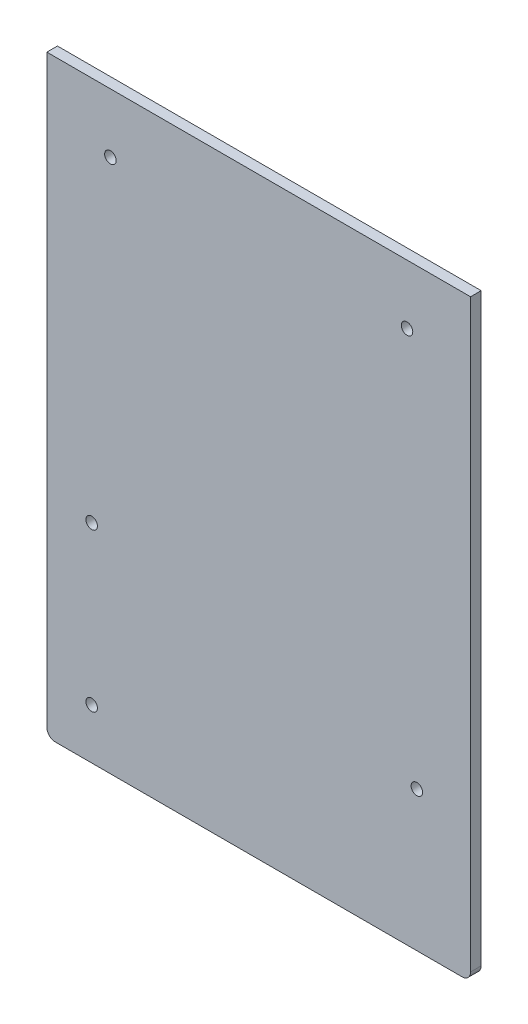
ISO-10303-21;
HEADER;
FILE_DESCRIPTION(('STEP AP214'),'2;1');
FILE_NAME('part.step','',(''),(''),'','','');
FILE_SCHEMA(('AUTOMOTIVE_DESIGN { 1 0 10303 214 1 1 1 1 }'));
ENDSEC;
DATA;
#1=APPLICATION_CONTEXT('core data for automotive mechanical design processes');
#2=APPLICATION_PROTOCOL_DEFINITION('international standard','automotive_design',2000,#1);
#3=PRODUCT_CONTEXT('',#1,'mechanical');
#4=PRODUCT('Part','Part','',(#3));
#5=PRODUCT_RELATED_PRODUCT_CATEGORY('part','',(#4));
#6=PRODUCT_DEFINITION_FORMATION('','',#4);
#7=PRODUCT_DEFINITION_CONTEXT('part definition',#1,'design');
#8=PRODUCT_DEFINITION('design','',#6,#7);
#9=PRODUCT_DEFINITION_SHAPE('','',#8);
#10=(LENGTH_UNIT() NAMED_UNIT(*) SI_UNIT(.MILLI.,.METRE.));
#11=(NAMED_UNIT(*) PLANE_ANGLE_UNIT() SI_UNIT($,.RADIAN.));
#12=(NAMED_UNIT(*) SI_UNIT($,.STERADIAN.) SOLID_ANGLE_UNIT());
#13=UNCERTAINTY_MEASURE_WITH_UNIT(LENGTH_MEASURE(1.E-05),#10,'distance_accuracy_value','');
#14=(GEOMETRIC_REPRESENTATION_CONTEXT(3) GLOBAL_UNCERTAINTY_ASSIGNED_CONTEXT((#13)) GLOBAL_UNIT_ASSIGNED_CONTEXT((#10,
#11,#12)) REPRESENTATION_CONTEXT('',''));
#15=CARTESIAN_POINT('',(0.,0.,0.));
#16=DIRECTION('',(0.,0.,1.));
#17=DIRECTION('',(1.,0.,0.));
#18=AXIS2_PLACEMENT_3D('',#15,#16,#17);
#19=CARTESIAN_POINT('',(-134.987671776237,109.744565217391,3.175));
#20=DIRECTION('',(1.,0.,0.));
#21=DIRECTION('',(0.,1.,0.));
#22=AXIS2_PLACEMENT_3D('',#19,#20,#21);
#23=PLANE('',#22);
#24=DIRECTION('',(0.,-1.,0.));
#25=VECTOR('',#24,1.);
#26=CARTESIAN_POINT('',(-134.987671776237,109.744565217391,0.));
#27=LINE('',#26,#25);
#28=CARTESIAN_POINT('',(-134.987671776237,109.744565217391,0.));
#29=VERTEX_POINT('',#28);
#30=CARTESIAN_POINT('',(-134.987671776237,-65.5154347826086,0.));
#31=VERTEX_POINT('',#30);
#32=EDGE_CURVE('E114',#29,#31,#27,.T.);
#33=ORIENTED_EDGE('',*,*,#32,.T.);
#34=DIRECTION('',(0.,0.,-1.));
#35=VECTOR('',#34,1.);
#36=CARTESIAN_POINT('',(-134.987671776237,-65.5154347826086,3.175));
#37=LINE('',#36,#35);
#38=CARTESIAN_POINT('',(-134.987671776237,-65.5154347826086,3.175));
#39=VERTEX_POINT('',#38);
#40=EDGE_CURVE('E58',#31,#39,#37,.F.);
#41=ORIENTED_EDGE('',*,*,#40,.T.);
#42=DIRECTION('',(0.,-1.,0.));
#43=VECTOR('',#42,1.);
#44=CARTESIAN_POINT('',(-134.987671776237,109.744565217391,3.175));
#45=LINE('',#44,#43);
#46=CARTESIAN_POINT('',(-134.987671776237,109.744565217391,3.175));
#47=VERTEX_POINT('',#46);
#48=EDGE_CURVE('E122',#47,#39,#45,.T.);
#49=ORIENTED_EDGE('',*,*,#48,.F.);
#50=DIRECTION('',(0.,0.,-1.));
#51=VECTOR('',#50,1.);
#52=CARTESIAN_POINT('',(-134.987671776237,109.744565217391,3.175));
#53=LINE('',#52,#51);
#54=EDGE_CURVE('E106',#47,#29,#53,.T.);
#55=ORIENTED_EDGE('',*,*,#54,.T.);
#56=EDGE_LOOP('',(#33,#41,#49,#55));
#57=FACE_BOUND('',#56,.T.);
#58=ADVANCED_FACE('F35',(#57),#23,.F.);
#59=CARTESIAN_POINT('',(-134.987671776237,-68.0554347826086,3.175));
#60=DIRECTION('',(0.,1.,0.));
#61=DIRECTION('',(0.,0.,1.));
#62=AXIS2_PLACEMENT_3D('',#59,#60,#61);
#63=PLANE('',#62);
#64=DIRECTION('',(1.,0.,0.));
#65=VECTOR('',#64,1.);
#66=CARTESIAN_POINT('',(-134.987671776237,-68.0554347826086,3.175));
#67=LINE('',#66,#65);
#68=CARTESIAN_POINT('',(-132.447671776237,-68.0554347826086,3.175));
#69=VERTEX_POINT('',#68);
#70=CARTESIAN_POINT('',(-10.5276717762367,-68.0554347826086,3.175));
#71=VERTEX_POINT('',#70);
#72=EDGE_CURVE('E96',#69,#71,#67,.T.);
#73=ORIENTED_EDGE('',*,*,#72,.F.);
#74=DIRECTION('',(0.,0.,-1.));
#75=VECTOR('',#74,1.);
#76=CARTESIAN_POINT('',(-132.447671776237,-68.0554347826086,3.175));
#77=LINE('',#76,#75);
#78=CARTESIAN_POINT('',(-132.447671776237,-68.0554347826086,0.));
#79=VERTEX_POINT('',#78);
#80=EDGE_CURVE('E125',#69,#79,#77,.T.);
#81=ORIENTED_EDGE('',*,*,#80,.T.);
#82=DIRECTION('',(1.,0.,0.));
#83=VECTOR('',#82,1.);
#84=CARTESIAN_POINT('',(-134.987671776237,-68.0554347826086,0.));
#85=LINE('',#84,#83);
#86=CARTESIAN_POINT('',(-10.5276717762367,-68.0554347826086,0.));
#87=VERTEX_POINT('',#86);
#88=EDGE_CURVE('E116',#79,#87,#85,.T.);
#89=ORIENTED_EDGE('',*,*,#88,.T.);
#90=DIRECTION('',(0.,0.,-1.));
#91=VECTOR('',#90,1.);
#92=CARTESIAN_POINT('',(-10.5276717762367,-68.0554347826086,3.175));
#93=LINE('',#92,#91);
#94=EDGE_CURVE('E105',#87,#71,#93,.F.);
#95=ORIENTED_EDGE('',*,*,#94,.T.);
#96=EDGE_LOOP('',(#73,#81,#89,#95));
#97=FACE_BOUND('',#96,.T.);
#98=ADVANCED_FACE('F138',(#97),#63,.F.);
#99=CARTESIAN_POINT('',(-7.98767177623672,109.744565217391,3.175));
#100=DIRECTION('',(-1.,0.,0.));
#101=DIRECTION('',(0.,-1.,0.));
#102=AXIS2_PLACEMENT_3D('',#99,#100,#101);
#103=PLANE('',#102);
#104=DIRECTION('',(0.,1.,0.));
#105=VECTOR('',#104,1.);
#106=CARTESIAN_POINT('',(-7.98767177623672,109.744565217391,3.175));
#107=LINE('',#106,#105);
#108=CARTESIAN_POINT('',(-7.9876717762367,-65.5154347826086,3.175));
#109=VERTEX_POINT('',#108);
#110=CARTESIAN_POINT('',(-7.98767177623672,109.744565217391,3.175));
#111=VERTEX_POINT('',#110);
#112=EDGE_CURVE('E88',#109,#111,#107,.T.);
#113=ORIENTED_EDGE('',*,*,#112,.F.);
#114=DIRECTION('',(0.,0.,-1.));
#115=VECTOR('',#114,1.);
#116=CARTESIAN_POINT('',(-7.9876717762367,-65.5154347826086,3.175));
#117=LINE('',#116,#115);
#118=CARTESIAN_POINT('',(-7.9876717762367,-65.5154347826086,0.));
#119=VERTEX_POINT('',#118);
#120=EDGE_CURVE('E11',#109,#119,#117,.T.);
#121=ORIENTED_EDGE('',*,*,#120,.T.);
#122=DIRECTION('',(0.,1.,0.));
#123=VECTOR('',#122,1.);
#124=CARTESIAN_POINT('',(-7.98767177623672,109.744565217391,0.));
#125=LINE('',#124,#123);
#126=CARTESIAN_POINT('',(-7.98767177623672,109.744565217391,0.));
#127=VERTEX_POINT('',#126);
#128=EDGE_CURVE('E102',#119,#127,#125,.T.);
#129=ORIENTED_EDGE('',*,*,#128,.T.);
#130=DIRECTION('',(0.,0.,-1.));
#131=VECTOR('',#130,1.);
#132=CARTESIAN_POINT('',(-7.98767177623672,109.744565217391,3.175));
#133=LINE('',#132,#131);
#134=EDGE_CURVE('E99',#111,#127,#133,.T.);
#135=ORIENTED_EDGE('',*,*,#134,.F.);
#136=EDGE_LOOP('',(#113,#121,#129,#135));
#137=FACE_BOUND('',#136,.T.);
#138=ADVANCED_FACE('F100',(#137),#103,.F.);
#139=CARTESIAN_POINT('',(-134.987671776237,109.744565217391,3.175));
#140=DIRECTION('',(0.,-1.,0.));
#141=DIRECTION('',(0.,0.,-1.));
#142=AXIS2_PLACEMENT_3D('',#139,#140,#141);
#143=PLANE('',#142);
#144=DIRECTION('',(-1.,0.,0.));
#145=VECTOR('',#144,1.);
#146=CARTESIAN_POINT('',(-134.987671776237,109.744565217391,0.));
#147=LINE('',#146,#145);
#148=EDGE_CURVE('E121',#127,#29,#147,.T.);
#149=ORIENTED_EDGE('',*,*,#148,.T.);
#150=ORIENTED_EDGE('',*,*,#54,.F.);
#151=DIRECTION('',(-1.,0.,0.));
#152=VECTOR('',#151,1.);
#153=CARTESIAN_POINT('',(-134.987671776237,109.744565217391,3.175));
#154=LINE('',#153,#152);
#155=EDGE_CURVE('E92',#111,#47,#154,.T.);
#156=ORIENTED_EDGE('',*,*,#155,.F.);
#157=ORIENTED_EDGE('',*,*,#134,.T.);
#158=EDGE_LOOP('',(#149,#150,#156,#157));
#159=FACE_BOUND('',#158,.T.);
#160=ADVANCED_FACE('F108',(#159),#143,.F.);
#161=CARTESIAN_POINT('',(0.,0.,3.175));
#162=DIRECTION('',(0.,0.,1.));
#163=DIRECTION('',(1.,0.,0.));
#164=AXIS2_PLACEMENT_3D('',#161,#162,#163);
#165=PLANE('',#164);
#166=CARTESIAN_POINT('',(-121.55028435249,-52.9587576809217,3.175));
#167=DIRECTION('',(0.,0.,1.));
#168=DIRECTION('',(1.,0.,0.));
#169=AXIS2_PLACEMENT_3D('',#166,#167,#168);
#170=CIRCLE('',#169,1.7272);
#171=CARTESIAN_POINT('',(-119.82308435249,-52.9587576809217,3.175));
#172=VERTEX_POINT('',#171);
#173=EDGE_CURVE('E173',#172,#172,#170,.T.);
#174=ORIENTED_EDGE('',*,*,#173,.F.);
#175=EDGE_LOOP('',(#174));
#176=FACE_BOUND('',#175,.T.);
#177=CARTESIAN_POINT('',(-121.55028435249,-5.71475768092172,3.175));
#178=DIRECTION('',(0.,0.,1.));
#179=DIRECTION('',(1.,0.,0.));
#180=AXIS2_PLACEMENT_3D('',#177,#178,#179);
#181=CIRCLE('',#180,1.7272);
#182=CARTESIAN_POINT('',(-119.82308435249,-5.71475768092172,3.175));
#183=VERTEX_POINT('',#182);
#184=EDGE_CURVE('E167',#183,#183,#181,.T.);
#185=ORIENTED_EDGE('',*,*,#184,.F.);
#186=EDGE_LOOP('',(#185));
#187=FACE_BOUND('',#186,.T.);
#188=CARTESIAN_POINT('',(-24.0914928508644,-26.1003060680185,3.175));
#189=DIRECTION('',(0.,0.,1.));
#190=DIRECTION('',(1.,0.,0.));
#191=AXIS2_PLACEMENT_3D('',#188,#189,#190);
#192=CIRCLE('',#191,1.7272);
#193=CARTESIAN_POINT('',(-22.3642928508644,-26.1003060680185,3.175));
#194=VERTEX_POINT('',#193);
#195=EDGE_CURVE('E161',#194,#194,#192,.T.);
#196=ORIENTED_EDGE('',*,*,#195,.F.);
#197=EDGE_LOOP('',(#196));
#198=FACE_BOUND('',#197,.T.);
#199=CARTESIAN_POINT('',(-27.0376717762367,91.9645652173914,3.175));
#200=DIRECTION('',(0.,0.,1.));
#201=DIRECTION('',(1.,0.,0.));
#202=AXIS2_PLACEMENT_3D('',#199,#200,#201);
#203=CIRCLE('',#202,1.7272);
#204=CARTESIAN_POINT('',(-25.3104717762367,91.9645652173914,3.175));
#205=VERTEX_POINT('',#204);
#206=EDGE_CURVE('E155',#205,#205,#203,.T.);
#207=ORIENTED_EDGE('',*,*,#206,.F.);
#208=EDGE_LOOP('',(#207));
#209=FACE_BOUND('',#208,.T.);
#210=CARTESIAN_POINT('',(-115.937671776237,91.9645652173914,3.175));
#211=DIRECTION('',(0.,0.,1.));
#212=DIRECTION('',(1.,0.,0.));
#213=AXIS2_PLACEMENT_3D('',#210,#211,#212);
#214=CIRCLE('',#213,1.7272);
#215=CARTESIAN_POINT('',(-114.210471776237,91.9645652173914,3.175));
#216=VERTEX_POINT('',#215);
#217=EDGE_CURVE('E149',#216,#216,#214,.T.);
#218=ORIENTED_EDGE('',*,*,#217,.F.);
#219=EDGE_LOOP('',(#218));
#220=FACE_BOUND('',#219,.T.);
#221=ORIENTED_EDGE('',*,*,#48,.T.);
#222=CARTESIAN_POINT('',(-132.447671776237,-65.5154347826086,3.175));
#223=DIRECTION('',(0.,0.,1.));
#224=DIRECTION('',(1.,0.,0.));
#225=AXIS2_PLACEMENT_3D('',#222,#223,#224);
#226=CIRCLE('',#225,2.54);
#227=EDGE_CURVE('E43',#39,#69,#226,.T.);
#228=ORIENTED_EDGE('',*,*,#227,.T.);
#229=ORIENTED_EDGE('',*,*,#72,.T.);
#230=CARTESIAN_POINT('',(-10.5276717762367,-65.5154347826086,3.175));
#231=DIRECTION('',(0.,0.,1.));
#232=DIRECTION('',(1.,0.,0.));
#233=AXIS2_PLACEMENT_3D('',#230,#231,#232);
#234=CIRCLE('',#233,2.54);
#235=EDGE_CURVE('E50',#71,#109,#234,.T.);
#236=ORIENTED_EDGE('',*,*,#235,.T.);
#237=ORIENTED_EDGE('',*,*,#112,.T.);
#238=ORIENTED_EDGE('',*,*,#155,.T.);
#239=EDGE_LOOP('',(#221,#228,#229,#236,#237,#238));
#240=FACE_BOUND('',#239,.T.);
#241=ADVANCED_FACE('F90',(#176,#187,#198,#209,#220,#240),#165,.T.);
#242=CARTESIAN_POINT('',(0.,0.,0.));
#243=DIRECTION('',(0.,0.,1.));
#244=DIRECTION('',(1.,0.,0.));
#245=AXIS2_PLACEMENT_3D('',#242,#243,#244);
#246=PLANE('',#245);
#247=CARTESIAN_POINT('',(-121.55028435249,-52.9587576809217,0.));
#248=DIRECTION('',(0.,0.,1.));
#249=DIRECTION('',(1.,0.,0.));
#250=AXIS2_PLACEMENT_3D('',#247,#248,#249);
#251=CIRCLE('',#250,1.7272);
#252=CARTESIAN_POINT('',(-119.82308435249,-52.9587576809217,0.));
#253=VERTEX_POINT('',#252);
#254=EDGE_CURVE('E170',#253,#253,#251,.T.);
#255=ORIENTED_EDGE('',*,*,#254,.T.);
#256=EDGE_LOOP('',(#255));
#257=FACE_BOUND('',#256,.T.);
#258=CARTESIAN_POINT('',(-121.55028435249,-5.71475768092172,0.));
#259=DIRECTION('',(0.,0.,1.));
#260=DIRECTION('',(1.,0.,0.));
#261=AXIS2_PLACEMENT_3D('',#258,#259,#260);
#262=CIRCLE('',#261,1.7272);
#263=CARTESIAN_POINT('',(-119.82308435249,-5.71475768092172,0.));
#264=VERTEX_POINT('',#263);
#265=EDGE_CURVE('E164',#264,#264,#262,.T.);
#266=ORIENTED_EDGE('',*,*,#265,.T.);
#267=EDGE_LOOP('',(#266));
#268=FACE_BOUND('',#267,.T.);
#269=CARTESIAN_POINT('',(-24.0914928508644,-26.1003060680185,0.));
#270=DIRECTION('',(0.,0.,1.));
#271=DIRECTION('',(1.,0.,0.));
#272=AXIS2_PLACEMENT_3D('',#269,#270,#271);
#273=CIRCLE('',#272,1.7272);
#274=CARTESIAN_POINT('',(-22.3642928508644,-26.1003060680185,0.));
#275=VERTEX_POINT('',#274);
#276=EDGE_CURVE('E158',#275,#275,#273,.T.);
#277=ORIENTED_EDGE('',*,*,#276,.T.);
#278=EDGE_LOOP('',(#277));
#279=FACE_BOUND('',#278,.T.);
#280=CARTESIAN_POINT('',(-27.0376717762367,91.9645652173914,0.));
#281=DIRECTION('',(0.,0.,1.));
#282=DIRECTION('',(1.,0.,0.));
#283=AXIS2_PLACEMENT_3D('',#280,#281,#282);
#284=CIRCLE('',#283,1.7272);
#285=CARTESIAN_POINT('',(-25.3104717762367,91.9645652173914,0.));
#286=VERTEX_POINT('',#285);
#287=EDGE_CURVE('E152',#286,#286,#284,.T.);
#288=ORIENTED_EDGE('',*,*,#287,.T.);
#289=EDGE_LOOP('',(#288));
#290=FACE_BOUND('',#289,.T.);
#291=CARTESIAN_POINT('',(-115.937671776237,91.9645652173914,0.));
#292=DIRECTION('',(0.,0.,1.));
#293=DIRECTION('',(1.,0.,0.));
#294=AXIS2_PLACEMENT_3D('',#291,#292,#293);
#295=CIRCLE('',#294,1.7272);
#296=CARTESIAN_POINT('',(-114.210471776237,91.9645652173914,0.));
#297=VERTEX_POINT('',#296);
#298=EDGE_CURVE('E117',#297,#297,#295,.T.);
#299=ORIENTED_EDGE('',*,*,#298,.T.);
#300=EDGE_LOOP('',(#299));
#301=FACE_BOUND('',#300,.T.);
#302=ORIENTED_EDGE('',*,*,#88,.F.);
#303=CARTESIAN_POINT('',(-132.447671776237,-65.5154347826086,0.));
#304=DIRECTION('',(0.,0.,1.));
#305=DIRECTION('',(1.,0.,0.));
#306=AXIS2_PLACEMENT_3D('',#303,#304,#305);
#307=CIRCLE('',#306,2.54);
#308=EDGE_CURVE('E130',#79,#31,#307,.F.);
#309=ORIENTED_EDGE('',*,*,#308,.T.);
#310=ORIENTED_EDGE('',*,*,#32,.F.);
#311=ORIENTED_EDGE('',*,*,#148,.F.);
#312=ORIENTED_EDGE('',*,*,#128,.F.);
#313=CARTESIAN_POINT('',(-10.5276717762367,-65.5154347826086,0.));
#314=DIRECTION('',(0.,0.,1.));
#315=DIRECTION('',(1.,0.,0.));
#316=AXIS2_PLACEMENT_3D('',#313,#314,#315);
#317=CIRCLE('',#316,2.54);
#318=EDGE_CURVE('E128',#119,#87,#317,.F.);
#319=ORIENTED_EDGE('',*,*,#318,.T.);
#320=EDGE_LOOP('',(#302,#309,#310,#311,#312,#319));
#321=FACE_BOUND('',#320,.T.);
#322=ADVANCED_FACE('F144',(#257,#268,#279,#290,#301,#321),#246,.F.);
#323=CARTESIAN_POINT('',(-115.937671776237,91.9645652173914,3.175));
#324=DIRECTION('',(0.,0.,1.));
#325=DIRECTION('',(1.,0.,0.));
#326=AXIS2_PLACEMENT_3D('',#323,#324,#325);
#327=CYLINDRICAL_SURFACE('',#326,1.7272);
#328=ORIENTED_EDGE('',*,*,#298,.F.);
#329=EDGE_LOOP('',(#328));
#330=FACE_BOUND('',#329,.T.);
#331=ORIENTED_EDGE('',*,*,#217,.T.);
#332=EDGE_LOOP('',(#331));
#333=FACE_BOUND('',#332,.T.);
#334=ADVANCED_FACE('F190',(#330,#333),#327,.F.);
#335=CARTESIAN_POINT('',(-27.0376717762367,91.9645652173914,3.175));
#336=DIRECTION('',(0.,0.,1.));
#337=DIRECTION('',(1.,0.,0.));
#338=AXIS2_PLACEMENT_3D('',#335,#336,#337);
#339=CYLINDRICAL_SURFACE('',#338,1.7272);
#340=ORIENTED_EDGE('',*,*,#287,.F.);
#341=EDGE_LOOP('',(#340));
#342=FACE_BOUND('',#341,.T.);
#343=ORIENTED_EDGE('',*,*,#206,.T.);
#344=EDGE_LOOP('',(#343));
#345=FACE_BOUND('',#344,.T.);
#346=ADVANCED_FACE('F192',(#342,#345),#339,.F.);
#347=CARTESIAN_POINT('',(-132.447671776237,-65.5154347826086,3.175));
#348=DIRECTION('',(0.,0.,-1.));
#349=DIRECTION('',(-1.,0.,0.));
#350=AXIS2_PLACEMENT_3D('',#347,#348,#349);
#351=CYLINDRICAL_SURFACE('',#350,2.54);
#352=ORIENTED_EDGE('',*,*,#227,.F.);
#353=ORIENTED_EDGE('',*,*,#40,.F.);
#354=ORIENTED_EDGE('',*,*,#308,.F.);
#355=ORIENTED_EDGE('',*,*,#80,.F.);
#356=EDGE_LOOP('',(#352,#353,#354,#355));
#357=FACE_BOUND('',#356,.T.);
#358=ADVANCED_FACE('F141',(#357),#351,.T.);
#359=CARTESIAN_POINT('',(-10.5276717762367,-65.5154347826086,3.175));
#360=DIRECTION('',(0.,0.,-1.));
#361=DIRECTION('',(-1.,0.,0.));
#362=AXIS2_PLACEMENT_3D('',#359,#360,#361);
#363=CYLINDRICAL_SURFACE('',#362,2.54);
#364=ORIENTED_EDGE('',*,*,#235,.F.);
#365=ORIENTED_EDGE('',*,*,#94,.F.);
#366=ORIENTED_EDGE('',*,*,#318,.F.);
#367=ORIENTED_EDGE('',*,*,#120,.F.);
#368=EDGE_LOOP('',(#364,#365,#366,#367));
#369=FACE_BOUND('',#368,.T.);
#370=ADVANCED_FACE('F37',(#369),#363,.T.);
#371=CARTESIAN_POINT('',(-24.0914928508644,-26.1003060680185,3.175));
#372=DIRECTION('',(0.,0.,1.));
#373=DIRECTION('',(1.,0.,0.));
#374=AXIS2_PLACEMENT_3D('',#371,#372,#373);
#375=CYLINDRICAL_SURFACE('',#374,1.7272);
#376=ORIENTED_EDGE('',*,*,#276,.F.);
#377=EDGE_LOOP('',(#376));
#378=FACE_BOUND('',#377,.T.);
#379=ORIENTED_EDGE('',*,*,#195,.T.);
#380=EDGE_LOOP('',(#379));
#381=FACE_BOUND('',#380,.T.);
#382=ADVANCED_FACE('F215',(#378,#381),#375,.F.);
#383=CARTESIAN_POINT('',(-121.55028435249,-5.71475768092172,3.175));
#384=DIRECTION('',(0.,0.,1.));
#385=DIRECTION('',(1.,0.,0.));
#386=AXIS2_PLACEMENT_3D('',#383,#384,#385);
#387=CYLINDRICAL_SURFACE('',#386,1.7272);
#388=ORIENTED_EDGE('',*,*,#265,.F.);
#389=EDGE_LOOP('',(#388));
#390=FACE_BOUND('',#389,.T.);
#391=ORIENTED_EDGE('',*,*,#184,.T.);
#392=EDGE_LOOP('',(#391));
#393=FACE_BOUND('',#392,.T.);
#394=ADVANCED_FACE('F220',(#390,#393),#387,.F.);
#395=CARTESIAN_POINT('',(-121.55028435249,-52.9587576809217,3.175));
#396=DIRECTION('',(0.,0.,1.));
#397=DIRECTION('',(1.,0.,0.));
#398=AXIS2_PLACEMENT_3D('',#395,#396,#397);
#399=CYLINDRICAL_SURFACE('',#398,1.7272);
#400=ORIENTED_EDGE('',*,*,#254,.F.);
#401=EDGE_LOOP('',(#400));
#402=FACE_BOUND('',#401,.T.);
#403=ORIENTED_EDGE('',*,*,#173,.T.);
#404=EDGE_LOOP('',(#403));
#405=FACE_BOUND('',#404,.T.);
#406=ADVANCED_FACE('F177',(#402,#405),#399,.F.);
#407=CLOSED_SHELL('',(#58,#98,#138,#160,#241,#322,#334,#346,#358,#370,#382,#394,#406));
#408=MANIFOLD_SOLID_BREP('B2',#407);
#409=ADVANCED_BREP_SHAPE_REPRESENTATION('',(#18,#408),#14);
#410=SHAPE_DEFINITION_REPRESENTATION(#9,#409);
ENDSEC;
END-ISO-10303-21;
